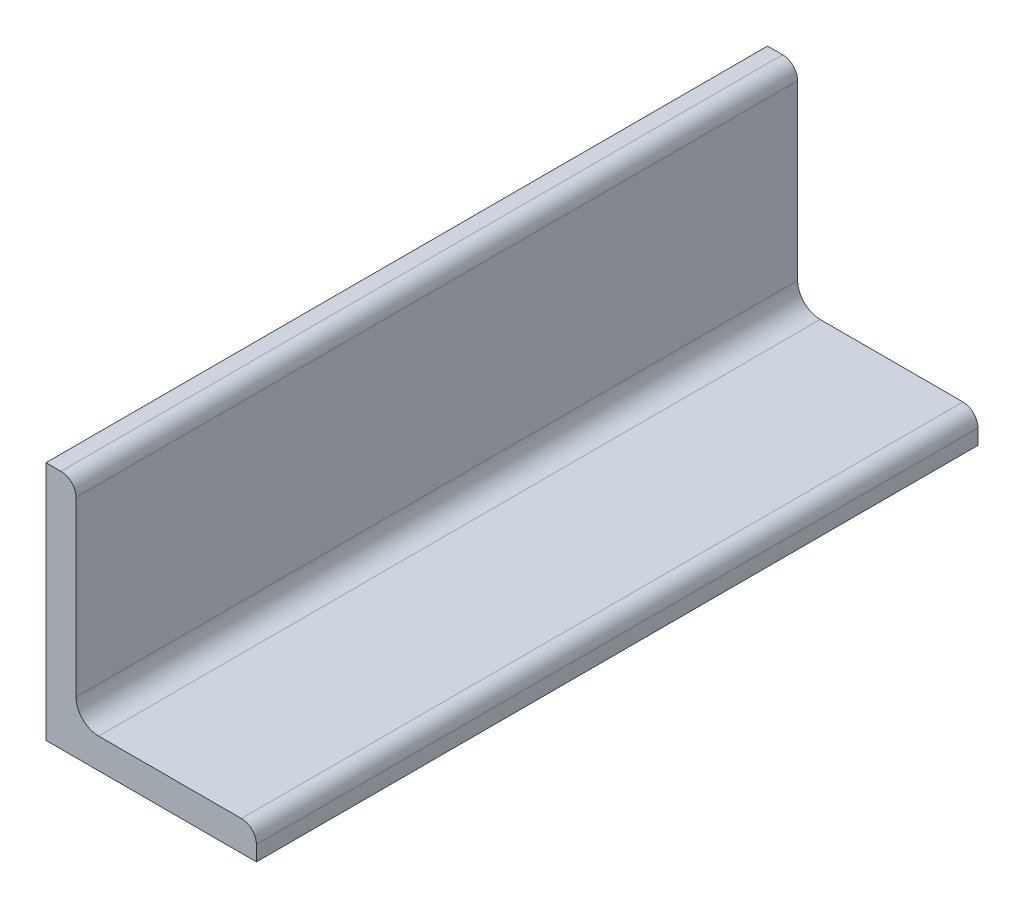
ISO-10303-21;
HEADER;
FILE_DESCRIPTION(('STEP AP214'),'2;1');
FILE_NAME('part.step','',(''),(''),'','','');
FILE_SCHEMA(('AUTOMOTIVE_DESIGN { 1 0 10303 214 1 1 1 1 }'));
ENDSEC;
DATA;
#1=APPLICATION_CONTEXT('core data for automotive mechanical design processes');
#2=APPLICATION_PROTOCOL_DEFINITION('international standard','automotive_design',2000,#1);
#3=PRODUCT_CONTEXT('',#1,'mechanical');
#4=PRODUCT('Part','Part','',(#3));
#5=PRODUCT_RELATED_PRODUCT_CATEGORY('part','',(#4));
#6=PRODUCT_DEFINITION_FORMATION('','',#4);
#7=PRODUCT_DEFINITION_CONTEXT('part definition',#1,'design');
#8=PRODUCT_DEFINITION('design','',#6,#7);
#9=PRODUCT_DEFINITION_SHAPE('','',#8);
#10=(LENGTH_UNIT() NAMED_UNIT(*) SI_UNIT(.MILLI.,.METRE.));
#11=(NAMED_UNIT(*) PLANE_ANGLE_UNIT() SI_UNIT($,.RADIAN.));
#12=(NAMED_UNIT(*) SI_UNIT($,.STERADIAN.) SOLID_ANGLE_UNIT());
#13=UNCERTAINTY_MEASURE_WITH_UNIT(LENGTH_MEASURE(1.E-05),#10,'distance_accuracy_value','');
#14=(GEOMETRIC_REPRESENTATION_CONTEXT(3) GLOBAL_UNCERTAINTY_ASSIGNED_CONTEXT((#13)) GLOBAL_UNIT_ASSIGNED_CONTEXT((#10,
#11,#12)) REPRESENTATION_CONTEXT('',''));
#15=CARTESIAN_POINT('',(0.,0.,0.));
#16=DIRECTION('',(0.,0.,1.));
#17=DIRECTION('',(1.,0.,0.));
#18=AXIS2_PLACEMENT_3D('',#15,#16,#17);
#19=CARTESIAN_POINT('',(0.0836264027816469,102.172018782971,304.8));
#20=DIRECTION('',(1.,0.,0.));
#21=DIRECTION('',(0.,0.,-1.));
#22=AXIS2_PLACEMENT_3D('',#19,#20,#21);
#23=PLANE('',#22);
#24=DIRECTION('',(0.,-1.,0.));
#25=VECTOR('',#24,1.);
#26=CARTESIAN_POINT('',(0.0836264027816469,102.172018782971,0.));
#27=LINE('',#26,#25);
#28=CARTESIAN_POINT('',(0.0836264027816469,102.172018782971,0.));
#29=VERTEX_POINT('',#28);
#30=CARTESIAN_POINT('',(0.0836264027816469,0.572018782971054,0.));
#31=VERTEX_POINT('',#30);
#32=EDGE_CURVE('E135',#29,#31,#27,.T.);
#33=ORIENTED_EDGE('',*,*,#32,.T.);
#34=DIRECTION('',(0.,0.,-1.));
#35=VECTOR('',#34,1.);
#36=CARTESIAN_POINT('',(0.0836264027816469,0.572018782971054,304.8));
#37=LINE('',#36,#35);
#38=CARTESIAN_POINT('',(0.0836264027816469,0.572018782971054,304.8));
#39=VERTEX_POINT('',#38);
#40=EDGE_CURVE('E11',#39,#31,#37,.T.);
#41=ORIENTED_EDGE('',*,*,#40,.F.);
#42=DIRECTION('',(0.,-1.,0.));
#43=VECTOR('',#42,1.);
#44=CARTESIAN_POINT('',(0.0836264027816469,102.172018782971,304.8));
#45=LINE('',#44,#43);
#46=CARTESIAN_POINT('',(0.0836264027816469,102.172018782971,304.8));
#47=VERTEX_POINT('',#46);
#48=EDGE_CURVE('E151',#47,#39,#45,.T.);
#49=ORIENTED_EDGE('',*,*,#48,.F.);
#50=DIRECTION('',(0.,0.,-1.));
#51=VECTOR('',#50,1.);
#52=CARTESIAN_POINT('',(0.0836264027816469,102.172018782971,304.8));
#53=LINE('',#52,#51);
#54=EDGE_CURVE('E131',#47,#29,#53,.T.);
#55=ORIENTED_EDGE('',*,*,#54,.T.);
#56=EDGE_LOOP('',(#33,#41,#49,#55));
#57=FACE_BOUND('',#56,.T.);
#58=ADVANCED_FACE('F33',(#57),#23,.F.);
#59=CARTESIAN_POINT('',(0.0836264027816469,0.572018782971054,304.8));
#60=DIRECTION('',(0.,1.,0.));
#61=DIRECTION('',(0.,0.,1.));
#62=AXIS2_PLACEMENT_3D('',#59,#60,#61);
#63=PLANE('',#62);
#64=DIRECTION('',(1.,0.,0.));
#65=VECTOR('',#64,1.);
#66=CARTESIAN_POINT('',(0.0836264027816469,0.572018782971054,0.));
#67=LINE('',#66,#65);
#68=CARTESIAN_POINT('',(88.9836264027817,0.572018782971054,0.));
#69=VERTEX_POINT('',#68);
#70=EDGE_CURVE('E138',#31,#69,#67,.T.);
#71=ORIENTED_EDGE('',*,*,#70,.T.);
#72=DIRECTION('',(0.,0.,-1.));
#73=VECTOR('',#72,1.);
#74=CARTESIAN_POINT('',(88.9836264027817,0.572018782971054,304.8));
#75=LINE('',#74,#73);
#76=CARTESIAN_POINT('',(88.9836264027817,0.572018782971054,304.8));
#77=VERTEX_POINT('',#76);
#78=EDGE_CURVE('E41',#77,#69,#75,.T.);
#79=ORIENTED_EDGE('',*,*,#78,.F.);
#80=DIRECTION('',(1.,0.,0.));
#81=VECTOR('',#80,1.);
#82=CARTESIAN_POINT('',(0.0836264027816469,0.572018782971054,304.8));
#83=LINE('',#82,#81);
#84=EDGE_CURVE('E95',#39,#77,#83,.T.);
#85=ORIENTED_EDGE('',*,*,#84,.F.);
#86=ORIENTED_EDGE('',*,*,#40,.T.);
#87=EDGE_LOOP('',(#71,#79,#85,#86));
#88=FACE_BOUND('',#87,.T.);
#89=ADVANCED_FACE('F194',(#88),#63,.F.);
#90=CARTESIAN_POINT('',(88.9836264027817,0.572018782971054,304.8));
#91=DIRECTION('',(-1.,0.,0.));
#92=DIRECTION('',(0.,0.,1.));
#93=AXIS2_PLACEMENT_3D('',#90,#91,#92);
#94=PLANE('',#93);
#95=DIRECTION('',(0.,1.,0.));
#96=VECTOR('',#95,1.);
#97=CARTESIAN_POINT('',(88.9836264027817,0.572018782971054,0.));
#98=LINE('',#97,#96);
#99=CARTESIAN_POINT('',(88.9836264027817,6.92201878297105,0.));
#100=VERTEX_POINT('',#99);
#101=EDGE_CURVE('E140',#69,#100,#98,.T.);
#102=ORIENTED_EDGE('',*,*,#101,.T.);
#103=DIRECTION('',(0.,0.,-1.));
#104=VECTOR('',#103,1.);
#105=CARTESIAN_POINT('',(88.9836264027817,6.92201878297105,304.8));
#106=LINE('',#105,#104);
#107=CARTESIAN_POINT('',(88.9836264027817,6.92201878297105,304.8));
#108=VERTEX_POINT('',#107);
#109=EDGE_CURVE('E161',#108,#100,#106,.T.);
#110=ORIENTED_EDGE('',*,*,#109,.F.);
#111=DIRECTION('',(0.,1.,0.));
#112=VECTOR('',#111,1.);
#113=CARTESIAN_POINT('',(88.9836264027817,0.572018782971054,304.8));
#114=LINE('',#113,#112);
#115=EDGE_CURVE('E169',#77,#108,#114,.T.);
#116=ORIENTED_EDGE('',*,*,#115,.F.);
#117=ORIENTED_EDGE('',*,*,#78,.T.);
#118=EDGE_LOOP('',(#102,#110,#116,#117));
#119=FACE_BOUND('',#118,.T.);
#120=ADVANCED_FACE('F167',(#119),#94,.F.);
#121=CARTESIAN_POINT('',(82.6336264027816,6.92201878297105,304.8));
#122=DIRECTION('',(0.,0.,-1.));
#123=DIRECTION('',(-1.,0.,0.));
#124=AXIS2_PLACEMENT_3D('',#121,#122,#123);
#125=CYLINDRICAL_SURFACE('',#124,6.35);
#126=CARTESIAN_POINT('',(82.6336264027816,6.92201878297105,0.));
#127=DIRECTION('',(0.,0.,1.));
#128=DIRECTION('',(1.,0.,0.));
#129=AXIS2_PLACEMENT_3D('',#126,#127,#128);
#130=CIRCLE('',#129,6.35);
#131=CARTESIAN_POINT('',(82.6336264027816,13.2720187829711,0.));
#132=VERTEX_POINT('',#131);
#133=EDGE_CURVE('E142',#100,#132,#130,.T.);
#134=ORIENTED_EDGE('',*,*,#133,.T.);
#135=DIRECTION('',(0.,0.,-1.));
#136=VECTOR('',#135,1.);
#137=CARTESIAN_POINT('',(82.6336264027816,13.2720187829711,304.8));
#138=LINE('',#137,#136);
#139=CARTESIAN_POINT('',(82.6336264027816,13.2720187829711,304.8));
#140=VERTEX_POINT('',#139);
#141=EDGE_CURVE('E158',#140,#132,#138,.T.);
#142=ORIENTED_EDGE('',*,*,#141,.F.);
#143=CARTESIAN_POINT('',(82.6336264027816,6.92201878297105,304.8));
#144=DIRECTION('',(0.,0.,1.));
#145=DIRECTION('',(1.,0.,0.));
#146=AXIS2_PLACEMENT_3D('',#143,#144,#145);
#147=CIRCLE('',#146,6.35);
#148=EDGE_CURVE('E185',#108,#140,#147,.T.);
#149=ORIENTED_EDGE('',*,*,#148,.F.);
#150=ORIENTED_EDGE('',*,*,#109,.T.);
#151=EDGE_LOOP('',(#134,#142,#149,#150));
#152=FACE_BOUND('',#151,.T.);
#153=ADVANCED_FACE('F178',(#152),#125,.T.);
#154=CARTESIAN_POINT('',(82.6336264027816,13.2720187829711,304.8));
#155=DIRECTION('',(0.,-1.,0.));
#156=DIRECTION('',(0.,0.,-1.));
#157=AXIS2_PLACEMENT_3D('',#154,#155,#156);
#158=PLANE('',#157);
#159=DIRECTION('',(-1.,0.,0.));
#160=VECTOR('',#159,1.);
#161=CARTESIAN_POINT('',(82.6336264027816,13.2720187829711,0.));
#162=LINE('',#161,#160);
#163=CARTESIAN_POINT('',(22.3086264027816,13.2720187829711,0.));
#164=VERTEX_POINT('',#163);
#165=EDGE_CURVE('E144',#132,#164,#162,.T.);
#166=ORIENTED_EDGE('',*,*,#165,.T.);
#167=DIRECTION('',(0.,0.,-1.));
#168=VECTOR('',#167,1.);
#169=CARTESIAN_POINT('',(22.3086264027816,13.2720187829711,304.8));
#170=LINE('',#169,#168);
#171=CARTESIAN_POINT('',(22.3086264027816,13.2720187829711,304.8));
#172=VERTEX_POINT('',#171);
#173=EDGE_CURVE('E155',#172,#164,#170,.T.);
#174=ORIENTED_EDGE('',*,*,#173,.F.);
#175=DIRECTION('',(-1.,0.,0.));
#176=VECTOR('',#175,1.);
#177=CARTESIAN_POINT('',(82.6336264027816,13.2720187829711,304.8));
#178=LINE('',#177,#176);
#179=EDGE_CURVE('E184',#140,#172,#178,.T.);
#180=ORIENTED_EDGE('',*,*,#179,.F.);
#181=ORIENTED_EDGE('',*,*,#141,.T.);
#182=EDGE_LOOP('',(#166,#174,#180,#181));
#183=FACE_BOUND('',#182,.T.);
#184=ADVANCED_FACE('F182',(#183),#158,.F.);
#185=CARTESIAN_POINT('',(22.3086264027816,22.797018782971,304.8));
#186=DIRECTION('',(0.,0.,-1.));
#187=DIRECTION('',(-1.,0.,0.));
#188=AXIS2_PLACEMENT_3D('',#185,#186,#187);
#189=CYLINDRICAL_SURFACE('',#188,9.52499999999999);
#190=CARTESIAN_POINT('',(22.3086264027816,22.797018782971,0.));
#191=DIRECTION('',(0.,0.,-1.));
#192=DIRECTION('',(1.,0.,0.));
#193=AXIS2_PLACEMENT_3D('',#190,#191,#192);
#194=CIRCLE('',#193,9.52499999999999);
#195=CARTESIAN_POINT('',(12.7836264027816,22.7970187829711,0.));
#196=VERTEX_POINT('',#195);
#197=EDGE_CURVE('E146',#164,#196,#194,.T.);
#198=ORIENTED_EDGE('',*,*,#197,.T.);
#199=DIRECTION('',(0.,0.,-1.));
#200=VECTOR('',#199,1.);
#201=CARTESIAN_POINT('',(12.7836264027816,22.7970187829711,304.8));
#202=LINE('',#201,#200);
#203=CARTESIAN_POINT('',(12.7836264027816,22.7970187829711,304.8));
#204=VERTEX_POINT('',#203);
#205=EDGE_CURVE('E126',#204,#196,#202,.T.);
#206=ORIENTED_EDGE('',*,*,#205,.F.);
#207=CARTESIAN_POINT('',(22.3086264027816,22.797018782971,304.8));
#208=DIRECTION('',(0.,0.,-1.));
#209=DIRECTION('',(1.,0.,0.));
#210=AXIS2_PLACEMENT_3D('',#207,#208,#209);
#211=CIRCLE('',#210,9.52499999999999);
#212=EDGE_CURVE('E117',#172,#204,#211,.T.);
#213=ORIENTED_EDGE('',*,*,#212,.F.);
#214=ORIENTED_EDGE('',*,*,#173,.T.);
#215=EDGE_LOOP('',(#198,#206,#213,#214));
#216=FACE_BOUND('',#215,.T.);
#217=ADVANCED_FACE('F206',(#216),#189,.F.);
#218=CARTESIAN_POINT('',(12.7836264027816,22.7970187829711,304.8));
#219=DIRECTION('',(-1.,0.,0.));
#220=DIRECTION('',(0.,0.,1.));
#221=AXIS2_PLACEMENT_3D('',#218,#219,#220);
#222=PLANE('',#221);
#223=DIRECTION('',(0.,1.,0.));
#224=VECTOR('',#223,1.);
#225=CARTESIAN_POINT('',(12.7836264027816,22.7970187829711,0.));
#226=LINE('',#225,#224);
#227=CARTESIAN_POINT('',(12.7836264027816,95.822018782971,0.));
#228=VERTEX_POINT('',#227);
#229=EDGE_CURVE('E125',#196,#228,#226,.T.);
#230=ORIENTED_EDGE('',*,*,#229,.T.);
#231=DIRECTION('',(0.,0.,-1.));
#232=VECTOR('',#231,1.);
#233=CARTESIAN_POINT('',(12.7836264027816,95.822018782971,304.8));
#234=LINE('',#233,#232);
#235=CARTESIAN_POINT('',(12.7836264027816,95.822018782971,304.8));
#236=VERTEX_POINT('',#235);
#237=EDGE_CURVE('E122',#236,#228,#234,.T.);
#238=ORIENTED_EDGE('',*,*,#237,.F.);
#239=DIRECTION('',(0.,1.,0.));
#240=VECTOR('',#239,1.);
#241=CARTESIAN_POINT('',(12.7836264027816,22.7970187829711,304.8));
#242=LINE('',#241,#240);
#243=EDGE_CURVE('E111',#204,#236,#242,.T.);
#244=ORIENTED_EDGE('',*,*,#243,.F.);
#245=ORIENTED_EDGE('',*,*,#205,.T.);
#246=EDGE_LOOP('',(#230,#238,#244,#245));
#247=FACE_BOUND('',#246,.T.);
#248=ADVANCED_FACE('F123',(#247),#222,.F.);
#249=CARTESIAN_POINT('',(6.43362640278165,95.822018782971,304.8));
#250=DIRECTION('',(0.,0.,-1.));
#251=DIRECTION('',(-1.,0.,0.));
#252=AXIS2_PLACEMENT_3D('',#249,#250,#251);
#253=CYLINDRICAL_SURFACE('',#252,6.35);
#254=CARTESIAN_POINT('',(6.43362640278165,95.822018782971,0.));
#255=DIRECTION('',(0.,0.,1.));
#256=DIRECTION('',(1.,0.,0.));
#257=AXIS2_PLACEMENT_3D('',#254,#255,#256);
#258=CIRCLE('',#257,6.35);
#259=CARTESIAN_POINT('',(6.43362640278165,102.172018782971,0.));
#260=VERTEX_POINT('',#259);
#261=EDGE_CURVE('E81',#228,#260,#258,.T.);
#262=ORIENTED_EDGE('',*,*,#261,.T.);
#263=DIRECTION('',(0.,0.,-1.));
#264=VECTOR('',#263,1.);
#265=CARTESIAN_POINT('',(6.43362640278165,102.172018782971,304.8));
#266=LINE('',#265,#264);
#267=CARTESIAN_POINT('',(6.43362640278165,102.172018782971,304.8));
#268=VERTEX_POINT('',#267);
#269=EDGE_CURVE('E127',#268,#260,#266,.T.);
#270=ORIENTED_EDGE('',*,*,#269,.F.);
#271=CARTESIAN_POINT('',(6.43362640278165,95.822018782971,304.8));
#272=DIRECTION('',(0.,0.,1.));
#273=DIRECTION('',(1.,0.,0.));
#274=AXIS2_PLACEMENT_3D('',#271,#272,#273);
#275=CIRCLE('',#274,6.35);
#276=EDGE_CURVE('E115',#236,#268,#275,.T.);
#277=ORIENTED_EDGE('',*,*,#276,.F.);
#278=ORIENTED_EDGE('',*,*,#237,.T.);
#279=EDGE_LOOP('',(#262,#270,#277,#278));
#280=FACE_BOUND('',#279,.T.);
#281=ADVANCED_FACE('F129',(#280),#253,.T.);
#282=CARTESIAN_POINT('',(6.43362640278165,102.172018782971,304.8));
#283=DIRECTION('',(0.,-1.,0.));
#284=DIRECTION('',(0.,0.,-1.));
#285=AXIS2_PLACEMENT_3D('',#282,#283,#284);
#286=PLANE('',#285);
#287=DIRECTION('',(-1.,0.,0.));
#288=VECTOR('',#287,1.);
#289=CARTESIAN_POINT('',(6.43362640278165,102.172018782971,0.));
#290=LINE('',#289,#288);
#291=EDGE_CURVE('E87',#260,#29,#290,.T.);
#292=ORIENTED_EDGE('',*,*,#291,.T.);
#293=ORIENTED_EDGE('',*,*,#54,.F.);
#294=DIRECTION('',(-1.,0.,0.));
#295=VECTOR('',#294,1.);
#296=CARTESIAN_POINT('',(6.43362640278165,102.172018782971,304.8));
#297=LINE('',#296,#295);
#298=EDGE_CURVE('E49',#268,#47,#297,.T.);
#299=ORIENTED_EDGE('',*,*,#298,.F.);
#300=ORIENTED_EDGE('',*,*,#269,.T.);
#301=EDGE_LOOP('',(#292,#293,#299,#300));
#302=FACE_BOUND('',#301,.T.);
#303=ADVANCED_FACE('F214',(#302),#286,.F.);
#304=CARTESIAN_POINT('',(82.6336264027816,6.92201878297105,304.8));
#305=DIRECTION('',(0.,0.,1.));
#306=DIRECTION('',(1.,0.,0.));
#307=AXIS2_PLACEMENT_3D('',#304,#305,#306);
#308=PLANE('',#307);
#309=ORIENTED_EDGE('',*,*,#48,.T.);
#310=ORIENTED_EDGE('',*,*,#84,.T.);
#311=ORIENTED_EDGE('',*,*,#115,.T.);
#312=ORIENTED_EDGE('',*,*,#148,.T.);
#313=ORIENTED_EDGE('',*,*,#179,.T.);
#314=ORIENTED_EDGE('',*,*,#212,.T.);
#315=ORIENTED_EDGE('',*,*,#243,.T.);
#316=ORIENTED_EDGE('',*,*,#276,.T.);
#317=ORIENTED_EDGE('',*,*,#298,.T.);
#318=EDGE_LOOP('',(#309,#310,#311,#312,#313,#314,#315,#316,#317));
#319=FACE_BOUND('',#318,.T.);
#320=ADVANCED_FACE('F113',(#319),#308,.T.);
#321=CARTESIAN_POINT('',(82.6336264027816,6.92201878297105,0.));
#322=DIRECTION('',(0.,0.,1.));
#323=DIRECTION('',(1.,0.,0.));
#324=AXIS2_PLACEMENT_3D('',#321,#322,#323);
#325=PLANE('',#324);
#326=ORIENTED_EDGE('',*,*,#32,.F.);
#327=ORIENTED_EDGE('',*,*,#291,.F.);
#328=ORIENTED_EDGE('',*,*,#261,.F.);
#329=ORIENTED_EDGE('',*,*,#229,.F.);
#330=ORIENTED_EDGE('',*,*,#197,.F.);
#331=ORIENTED_EDGE('',*,*,#165,.F.);
#332=ORIENTED_EDGE('',*,*,#133,.F.);
#333=ORIENTED_EDGE('',*,*,#101,.F.);
#334=ORIENTED_EDGE('',*,*,#70,.F.);
#335=EDGE_LOOP('',(#326,#327,#328,#329,#330,#331,#332,#333,#334));
#336=FACE_BOUND('',#335,.T.);
#337=ADVANCED_FACE('F173',(#336),#325,.F.);
#338=CLOSED_SHELL('',(#58,#89,#120,#153,#184,#217,#248,#281,#303,#320,#337));
#339=MANIFOLD_SOLID_BREP('B2',#338);
#340=ADVANCED_BREP_SHAPE_REPRESENTATION('',(#18,#339),#14);
#341=SHAPE_DEFINITION_REPRESENTATION(#9,#340);
ENDSEC;
END-ISO-10303-21;
